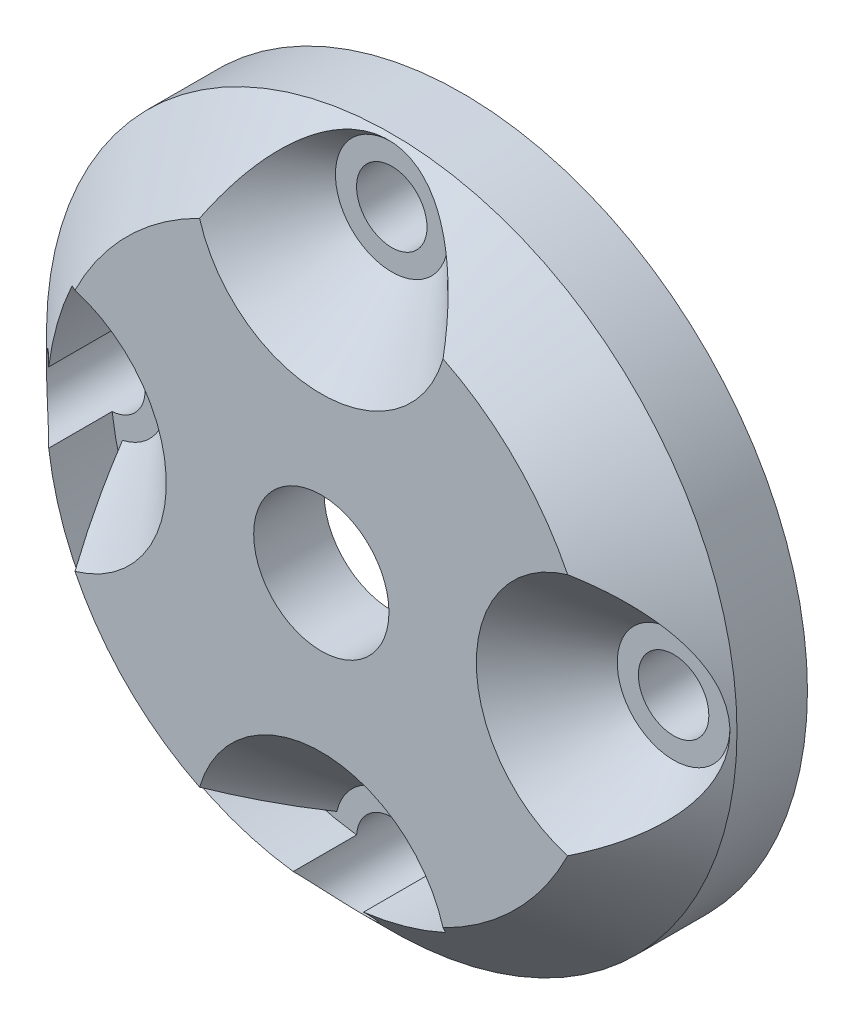
ISO-10303-21;
HEADER;
FILE_DESCRIPTION(('STEP AP214'),'2;1');
FILE_NAME('part.step','',(''),(''),'','','');
FILE_SCHEMA(('AUTOMOTIVE_DESIGN { 1 0 10303 214 1 1 1 1 }'));
ENDSEC;
DATA;
#1=APPLICATION_CONTEXT('core data for automotive mechanical design processes');
#2=APPLICATION_PROTOCOL_DEFINITION('international standard','automotive_design',2000,#1);
#3=PRODUCT_CONTEXT('',#1,'mechanical');
#4=PRODUCT('Part','Part','',(#3));
#5=PRODUCT_RELATED_PRODUCT_CATEGORY('part','',(#4));
#6=PRODUCT_DEFINITION_FORMATION('','',#4);
#7=PRODUCT_DEFINITION_CONTEXT('part definition',#1,'design');
#8=PRODUCT_DEFINITION('design','',#6,#7);
#9=PRODUCT_DEFINITION_SHAPE('','',#8);
#10=(LENGTH_UNIT() NAMED_UNIT(*) SI_UNIT(.MILLI.,.METRE.));
#11=(NAMED_UNIT(*) PLANE_ANGLE_UNIT() SI_UNIT($,.RADIAN.));
#12=(NAMED_UNIT(*) SI_UNIT($,.STERADIAN.) SOLID_ANGLE_UNIT());
#13=UNCERTAINTY_MEASURE_WITH_UNIT(LENGTH_MEASURE(1.E-05),#10,'distance_accuracy_value','');
#14=(GEOMETRIC_REPRESENTATION_CONTEXT(3) GLOBAL_UNCERTAINTY_ASSIGNED_CONTEXT((#13)) GLOBAL_UNIT_ASSIGNED_CONTEXT((#10,
#11,#12)) REPRESENTATION_CONTEXT('',''));
#15=CARTESIAN_POINT('',(0.,0.,0.));
#16=DIRECTION('',(0.,0.,1.));
#17=DIRECTION('',(1.,0.,0.));
#18=AXIS2_PLACEMENT_3D('',#15,#16,#17);
#19=CARTESIAN_POINT('',(10.,0.,0.));
#20=DIRECTION('',(0.,0.,1.));
#21=DIRECTION('',(1.,0.,0.));
#22=AXIS2_PLACEMENT_3D('',#19,#20,#21);
#23=CYLINDRICAL_SURFACE('',#22,1.25);
#24=CARTESIAN_POINT('',(10.,0.,0.));
#25=DIRECTION('',(0.,0.,1.));
#26=DIRECTION('',(1.,0.,0.));
#27=AXIS2_PLACEMENT_3D('',#24,#25,#26);
#28=CIRCLE('',#27,1.25);
#29=CARTESIAN_POINT('',(11.25,0.,0.));
#30=VERTEX_POINT('',#29);
#31=EDGE_CURVE('E204',#30,#30,#28,.T.);
#32=ORIENTED_EDGE('',*,*,#31,.F.);
#33=EDGE_LOOP('',(#32));
#34=FACE_BOUND('',#33,.T.);
#35=CARTESIAN_POINT('',(10.,0.,2.5));
#36=DIRECTION('',(0.,0.,1.));
#37=DIRECTION('',(1.,0.,0.));
#38=AXIS2_PLACEMENT_3D('',#35,#36,#37);
#39=CIRCLE('',#38,1.25);
#40=CARTESIAN_POINT('',(11.25,0.,2.5));
#41=VERTEX_POINT('',#40);
#42=EDGE_CURVE('E190',#41,#41,#39,.F.);
#43=ORIENTED_EDGE('',*,*,#42,.F.);
#44=EDGE_LOOP('',(#43));
#45=FACE_BOUND('',#44,.T.);
#46=ADVANCED_FACE('F55',(#34,#45),#23,.F.);
#47=CARTESIAN_POINT('',(0.,10.,0.));
#48=DIRECTION('',(0.,0.,1.));
#49=DIRECTION('',(1.,0.,0.));
#50=AXIS2_PLACEMENT_3D('',#47,#48,#49);
#51=CYLINDRICAL_SURFACE('',#50,1.25);
#52=CARTESIAN_POINT('',(0.,10.,0.));
#53=DIRECTION('',(0.,0.,1.));
#54=DIRECTION('',(1.,0.,0.));
#55=AXIS2_PLACEMENT_3D('',#52,#53,#54);
#56=CIRCLE('',#55,1.25);
#57=CARTESIAN_POINT('',(1.25,10.,0.));
#58=VERTEX_POINT('',#57);
#59=EDGE_CURVE('E200',#58,#58,#56,.T.);
#60=ORIENTED_EDGE('',*,*,#59,.F.);
#61=EDGE_LOOP('',(#60));
#62=FACE_BOUND('',#61,.T.);
#63=CARTESIAN_POINT('',(0.,10.,2.5));
#64=DIRECTION('',(0.,0.,1.));
#65=DIRECTION('',(1.,0.,0.));
#66=AXIS2_PLACEMENT_3D('',#63,#64,#65);
#67=CIRCLE('',#66,1.25);
#68=CARTESIAN_POINT('',(1.25,10.,2.5));
#69=VERTEX_POINT('',#68);
#70=EDGE_CURVE('E576',#69,#69,#67,.F.);
#71=ORIENTED_EDGE('',*,*,#70,.F.);
#72=EDGE_LOOP('',(#71));
#73=FACE_BOUND('',#72,.T.);
#74=ADVANCED_FACE('F277',(#62,#73),#51,.F.);
#75=CARTESIAN_POINT('',(0.,0.,5.));
#76=DIRECTION('',(0.,0.,-1.));
#77=DIRECTION('',(-1.,0.,0.));
#78=AXIS2_PLACEMENT_3D('',#75,#76,#77);
#79=CYLINDRICAL_SURFACE('',#78,2.4);
#80=CARTESIAN_POINT('',(0.,0.,5.));
#81=DIRECTION('',(0.,0.,1.));
#82=DIRECTION('',(1.,0.,0.));
#83=AXIS2_PLACEMENT_3D('',#80,#81,#82);
#84=CIRCLE('',#83,2.4);
#85=CARTESIAN_POINT('',(2.4,0.,5.));
#86=VERTEX_POINT('',#85);
#87=EDGE_CURVE('E219',#86,#86,#84,.T.);
#88=ORIENTED_EDGE('',*,*,#87,.T.);
#89=EDGE_LOOP('',(#88));
#90=FACE_BOUND('',#89,.T.);
#91=CARTESIAN_POINT('',(0.,0.,2.5));
#92=DIRECTION('',(0.,0.,-1.));
#93=DIRECTION('',(-1.,0.,0.));
#94=AXIS2_PLACEMENT_3D('',#91,#92,#93);
#95=CIRCLE('',#94,2.4);
#96=CARTESIAN_POINT('',(-2.4,0.,2.5));
#97=VERTEX_POINT('',#96);
#98=EDGE_CURVE('E216',#97,#97,#95,.T.);
#99=ORIENTED_EDGE('',*,*,#98,.T.);
#100=EDGE_LOOP('',(#99));
#101=FACE_BOUND('',#100,.T.);
#102=ADVANCED_FACE('F273',(#90,#101),#79,.F.);
#103=CARTESIAN_POINT('',(0.,0.,5.));
#104=DIRECTION('',(0.,0.,1.));
#105=DIRECTION('',(1.,0.,0.));
#106=AXIS2_PLACEMENT_3D('',#103,#104,#105);
#107=PLANE('',#106);
#108=CARTESIAN_POINT('',(0.,0.,5.));
#109=DIRECTION('',(0.,0.,1.));
#110=DIRECTION('',(1.,0.,0.));
#111=AXIS2_PLACEMENT_3D('',#108,#109,#110);
#112=CIRCLE('',#111,9.75);
#113=CARTESIAN_POINT('',(-4.32018224261304,8.7406249999992,5.));
#114=VERTEX_POINT('',#113);
#115=CARTESIAN_POINT('',(-8.74062499999988,4.32018224261167,5.));
#116=VERTEX_POINT('',#115);
#117=EDGE_CURVE('E232',#114,#116,#112,.T.);
#118=ORIENTED_EDGE('',*,*,#117,.T.);
#119=CARTESIAN_POINT('',(-9.99999999999972,-2.83604770904466E-13,5.));
#120=DIRECTION('',(0.,0.,1.));
#121=DIRECTION('',(1.,0.,0.));
#122=AXIS2_PLACEMENT_3D('',#119,#120,#121);
#123=CIRCLE('',#122,4.50000000000047);
#124=CARTESIAN_POINT('',(-8.74062499999963,-4.32018224261216,5.));
#125=VERTEX_POINT('',#124);
#126=EDGE_CURVE('E161',#116,#125,#123,.F.);
#127=ORIENTED_EDGE('',*,*,#126,.T.);
#128=CARTESIAN_POINT('',(0.,0.,5.));
#129=DIRECTION('',(0.,0.,1.));
#130=DIRECTION('',(1.,0.,0.));
#131=AXIS2_PLACEMENT_3D('',#128,#129,#130);
#132=CIRCLE('',#131,9.75);
#133=CARTESIAN_POINT('',(-4.32018224261149,-8.74062499999997,5.));
#134=VERTEX_POINT('',#133);
#135=EDGE_CURVE('E170',#125,#134,#132,.T.);
#136=ORIENTED_EDGE('',*,*,#135,.T.);
#137=CARTESIAN_POINT('',(5.64760248210638E-13,-10.,5.));
#138=DIRECTION('',(0.,0.,1.));
#139=DIRECTION('',(1.,0.,0.));
#140=AXIS2_PLACEMENT_3D('',#137,#138,#139);
#141=CIRCLE('',#140,4.50000000000063);
#142=CARTESIAN_POINT('',(4.32018224261248,-8.74062499999948,5.));
#143=VERTEX_POINT('',#142);
#144=EDGE_CURVE('E156',#134,#143,#141,.F.);
#145=ORIENTED_EDGE('',*,*,#144,.T.);
#146=CARTESIAN_POINT('',(8.74062500000006,-4.32018224261131,5.));
#147=VERTEX_POINT('',#146);
#148=EDGE_CURVE('E225',#143,#147,#112,.T.);
#149=ORIENTED_EDGE('',*,*,#148,.T.);
#150=CARTESIAN_POINT('',(10.0000000000003,2.82380124105319E-13,5.));
#151=DIRECTION('',(0.,0.,1.));
#152=DIRECTION('',(1.,0.,0.));
#153=AXIS2_PLACEMENT_3D('',#150,#151,#152);
#154=CIRCLE('',#153,4.50000000000023);
#155=CARTESIAN_POINT('',(8.74062499999981,4.3201822426118,5.));
#156=VERTEX_POINT('',#155);
#157=EDGE_CURVE('E354',#147,#156,#154,.F.);
#158=ORIENTED_EDGE('',*,*,#157,.T.);
#159=CARTESIAN_POINT('',(4.32018224261304,8.7406249999992,5.));
#160=VERTEX_POINT('',#159);
#161=EDGE_CURVE('E228',#156,#160,#112,.T.);
#162=ORIENTED_EDGE('',*,*,#161,.T.);
#163=CARTESIAN_POINT('',(0.,10.,5.));
#164=DIRECTION('',(0.,0.,1.));
#165=DIRECTION('',(1.,0.,0.));
#166=AXIS2_PLACEMENT_3D('',#163,#164,#165);
#167=CIRCLE('',#166,4.50000000000178);
#168=EDGE_CURVE('E345',#160,#114,#167,.F.);
#169=ORIENTED_EDGE('',*,*,#168,.T.);
#170=EDGE_LOOP('',(#118,#127,#136,#145,#149,#158,#162,#169));
#171=FACE_BOUND('',#170,.T.);
#172=ORIENTED_EDGE('',*,*,#87,.F.);
#173=EDGE_LOOP('',(#172));
#174=FACE_BOUND('',#173,.T.);
#175=ADVANCED_FACE('F276',(#171,#174),#107,.T.);
#176=CARTESIAN_POINT('',(0.,0.,0.));
#177=DIRECTION('',(0.,0.,1.));
#178=DIRECTION('',(1.,0.,0.));
#179=AXIS2_PLACEMENT_3D('',#176,#177,#178);
#180=PLANE('',#179);
#181=ORIENTED_EDGE('',*,*,#59,.T.);
#182=EDGE_LOOP('',(#181));
#183=FACE_BOUND('',#182,.T.);
#184=ORIENTED_EDGE('',*,*,#31,.T.);
#185=EDGE_LOOP('',(#184));
#186=FACE_BOUND('',#185,.T.);
#187=CARTESIAN_POINT('',(0.,-10.,0.));
#188=DIRECTION('',(0.,0.,1.));
#189=DIRECTION('',(1.,0.,0.));
#190=AXIS2_PLACEMENT_3D('',#187,#188,#189);
#191=CIRCLE('',#190,1.25);
#192=CARTESIAN_POINT('',(1.24999999999993,-10.,0.));
#193=VERTEX_POINT('',#192);
#194=EDGE_CURVE('E207',#193,#193,#191,.T.);
#195=ORIENTED_EDGE('',*,*,#194,.T.);
#196=EDGE_LOOP('',(#195));
#197=FACE_BOUND('',#196,.T.);
#198=CARTESIAN_POINT('',(-10.,1.04744440165294E-13,0.));
#199=DIRECTION('',(0.,0.,1.));
#200=DIRECTION('',(1.,0.,0.));
#201=AXIS2_PLACEMENT_3D('',#198,#199,#200);
#202=CIRCLE('',#201,1.25);
#203=CARTESIAN_POINT('',(-8.75,1.04744440165294E-13,0.));
#204=VERTEX_POINT('',#203);
#205=EDGE_CURVE('E210',#204,#204,#202,.T.);
#206=ORIENTED_EDGE('',*,*,#205,.T.);
#207=EDGE_LOOP('',(#206));
#208=FACE_BOUND('',#207,.T.);
#209=CARTESIAN_POINT('',(0.,0.,0.));
#210=DIRECTION('',(0.,0.,-1.));
#211=DIRECTION('',(-1.,0.,0.));
#212=AXIS2_PLACEMENT_3D('',#209,#210,#211);
#213=CIRCLE('',#212,7.5);
#214=CARTESIAN_POINT('',(-7.5,0.,0.));
#215=VERTEX_POINT('',#214);
#216=EDGE_CURVE('E203',#215,#215,#213,.T.);
#217=ORIENTED_EDGE('',*,*,#216,.F.);
#218=EDGE_LOOP('',(#217));
#219=FACE_BOUND('',#218,.T.);
#220=CARTESIAN_POINT('',(0.,0.,0.));
#221=DIRECTION('',(0.,0.,1.));
#222=DIRECTION('',(1.,0.,0.));
#223=AXIS2_PLACEMENT_3D('',#220,#221,#222);
#224=CIRCLE('',#223,12.25);
#225=CARTESIAN_POINT('',(12.25,0.,0.));
#226=VERTEX_POINT('',#225);
#227=EDGE_CURVE('E222',#226,#226,#224,.T.);
#228=ORIENTED_EDGE('',*,*,#227,.F.);
#229=EDGE_LOOP('',(#228));
#230=FACE_BOUND('',#229,.T.);
#231=ADVANCED_FACE('F281',(#183,#186,#197,#208,#219,#230),#180,.F.);
#232=CARTESIAN_POINT('',(0.,0.,5.));
#233=DIRECTION('',(0.,0.,-1.));
#234=DIRECTION('',(-1.,0.,0.));
#235=AXIS2_PLACEMENT_3D('',#232,#233,#234);
#236=CYLINDRICAL_SURFACE('',#235,12.25);
#237=CARTESIAN_POINT('',(0.,0.,2.49999999999999));
#238=DIRECTION('',(0.,0.,1.));
#239=DIRECTION('',(1.,0.,0.));
#240=AXIS2_PLACEMENT_3D('',#237,#238,#239);
#241=CIRCLE('',#240,12.25);
#242=CARTESIAN_POINT('',(12.25,0.,2.49999999999999));
#243=VERTEX_POINT('',#242);
#244=EDGE_CURVE('E231',#243,#243,#241,.F.);
#245=ORIENTED_EDGE('',*,*,#244,.T.);
#246=EDGE_LOOP('',(#245));
#247=FACE_BOUND('',#246,.T.);
#248=ORIENTED_EDGE('',*,*,#227,.T.);
#249=EDGE_LOOP('',(#248));
#250=FACE_BOUND('',#249,.T.);
#251=ADVANCED_FACE('F271',(#247,#250),#236,.T.);
#252=CARTESIAN_POINT('',(0.,0.,2.5));
#253=DIRECTION('',(0.,0.,-1.));
#254=DIRECTION('',(-1.,0.,0.));
#255=AXIS2_PLACEMENT_3D('',#252,#253,#254);
#256=CYLINDRICAL_SURFACE('',#255,7.5);
#257=CARTESIAN_POINT('',(0.,0.,2.5));
#258=DIRECTION('',(0.,0.,-1.));
#259=DIRECTION('',(-1.,0.,0.));
#260=AXIS2_PLACEMENT_3D('',#257,#258,#259);
#261=CIRCLE('',#260,7.5);
#262=CARTESIAN_POINT('',(-7.5,0.,2.5));
#263=VERTEX_POINT('',#262);
#264=EDGE_CURVE('E213',#263,#263,#261,.T.);
#265=ORIENTED_EDGE('',*,*,#264,.F.);
#266=EDGE_LOOP('',(#265));
#267=FACE_BOUND('',#266,.T.);
#268=ORIENTED_EDGE('',*,*,#216,.T.);
#269=EDGE_LOOP('',(#268));
#270=FACE_BOUND('',#269,.T.);
#271=ADVANCED_FACE('F267',(#267,#270),#256,.F.);
#272=CARTESIAN_POINT('',(0.,0.,2.5));
#273=DIRECTION('',(0.,0.,-1.));
#274=DIRECTION('',(-1.,0.,0.));
#275=AXIS2_PLACEMENT_3D('',#272,#273,#274);
#276=PLANE('',#275);
#277=ORIENTED_EDGE('',*,*,#98,.F.);
#278=EDGE_LOOP('',(#277));
#279=FACE_BOUND('',#278,.T.);
#280=ORIENTED_EDGE('',*,*,#264,.T.);
#281=EDGE_LOOP('',(#280));
#282=FACE_BOUND('',#281,.T.);
#283=ADVANCED_FACE('F264',(#279,#282),#276,.T.);
#284=CARTESIAN_POINT('',(0.,0.,5.));
#285=DIRECTION('',(0.,0.,-1.));
#286=DIRECTION('',(-1.,0.,0.));
#287=AXIS2_PLACEMENT_3D('',#284,#285,#286);
#288=CONICAL_SURFACE('',#287,9.75,0.785398163397447);
#289=CARTESIAN_POINT('',(0.,0.,4.75));
#290=DIRECTION('',(0.,0.,-1.));
#291=DIRECTION('',(-1.,0.,0.));
#292=AXIS2_PLACEMENT_3D('',#289,#290,#291);
#293=CIRCLE('',#292,10.);
#294=CARTESIAN_POINT('',(-9.09687499999981,4.15293453287895,4.75));
#295=VERTEX_POINT('',#294);
#296=CARTESIAN_POINT('',(-9.92187499999999,1.2475562048963,4.75));
#297=VERTEX_POINT('',#296);
#298=EDGE_CURVE('E193',#295,#297,#293,.F.);
#299=ORIENTED_EDGE('',*,*,#298,.F.);
#300=CARTESIAN_POINT('',(-9.09687499999981,4.15293453287895,4.75));
#301=CARTESIAN_POINT('',(-9.03799781672567,4.18239221546086,4.79131732159591));
#302=CARTESIAN_POINT('',(-8.97887165867161,4.21105839506153,4.83280936233562));
#303=CARTESIAN_POINT('',(-8.86012165646222,4.26680762461525,4.91614269721942));
#304=CARTESIAN_POINT('',(-8.80049781451638,4.29389068159238,4.95798398981301));
#305=CARTESIAN_POINT('',(-8.74062500000011,4.32018224261234,4.99999999999986));
#306=B_SPLINE_CURVE_WITH_KNOTS('',3,(#300,#301,#302,#303,#304,#305),.UNSPECIFIED.,.F.,.F.,(4,2,
4),(0.,0.233137677724734,0.466274320974145),.UNSPECIFIED.);
#307=EDGE_CURVE('E338',#295,#116,#306,.T.);
#308=ORIENTED_EDGE('',*,*,#307,.T.);
#309=ORIENTED_EDGE('',*,*,#117,.F.);
#310=CARTESIAN_POINT('',(-4.32018224261304,8.7406249999992,5.));
#311=CARTESIAN_POINT('',(-4.24543055087863,8.91058201609543,4.88073191852881));
#312=CARTESIAN_POINT('',(-4.16452033532962,9.07882987951336,4.76266324244619));
#313=CARTESIAN_POINT('',(-3.98900218578794,9.41105191644683,4.5295249709142));
#314=CARTESIAN_POINT('',(-3.8943538287284,9.57501173142422,4.41446545163195));
#315=CARTESIAN_POINT('',(-3.68898800019662,9.8990149787888,4.18709475172665));
#316=CARTESIAN_POINT('',(-3.57806427853655,10.0589715511141,4.07484452553301));
#317=CARTESIAN_POINT('',(-3.33983066901543,10.3703159019421,3.85635726179548));
#318=CARTESIAN_POINT('',(-3.21254260452706,10.52171471272,3.75011248230405));
#319=CARTESIAN_POINT('',(-3.0021155514262,10.7467492054825,3.59219354001071));
#320=CARTESIAN_POINT('',(-2.92530867099643,10.8243666997947,3.53772512294688));
#321=CARTESIAN_POINT('',(-2.76610897034105,10.9756572422736,3.43155632122561));
#322=CARTESIAN_POINT('',(-2.68371593121603,11.0493301356643,3.37985604518288));
#323=CARTESIAN_POINT('',(-2.42832866149789,11.2629506525067,3.22994691045144));
#324=CARTESIAN_POINT('',(-2.24656738245421,11.396111832867,3.1365004678006));
#325=CARTESIAN_POINT('',(-1.88803443535945,11.6185989153388,2.98036918252651));
#326=CARTESIAN_POINT('',(-1.71463674973222,11.7115064915249,2.91517088422964));
#327=CARTESIAN_POINT('',(-1.4425049660832,11.8325463946807,2.83023060082394));
#328=CARTESIAN_POINT('',(-1.34979089782447,11.8698387677386,2.80406051402755));
#329=CARTESIAN_POINT('',(-1.16068321970715,11.937580161585,2.75652269346862));
#330=CARTESIAN_POINT('',(-1.06429035777016,11.9680305648091,2.73515398957565));
#331=CARTESIAN_POINT('',(-0.88516255211972,12.0167920225301,2.70093542281237));
#332=CARTESIAN_POINT('',(-0.802907353842056,12.0362882027188,2.68725389281854));
#333=CARTESIAN_POINT('',(-0.636727261646473,12.0697030799028,2.66380485622176));
#334=CARTESIAN_POINT('',(-0.552802677513388,12.0836228017609,2.65403663041677));
#335=CARTESIAN_POINT('',(-0.383849904894684,12.1055961116841,2.63861676380702));
#336=CARTESIAN_POINT('',(-0.298822235814207,12.1136523654161,2.63296325235893));
#337=CARTESIAN_POINT('',(-0.128230244820367,12.1237340377041,2.62588839457439));
#338=CARTESIAN_POINT('',(-0.0426659115687846,12.1257593284097,2.62446713795756));
#339=CARTESIAN_POINT('',(0.128416440977701,12.1237323186584,2.62588960094193));
#340=CARTESIAN_POINT('',(0.213934382495788,12.1196756386246,2.62873639393044));
#341=CARTESIAN_POINT('',(0.384223345047145,12.1055676446171,2.63863674063701));
#342=CARTESIAN_POINT('',(0.468994380781321,12.0955164488987,2.64569021136897));
#343=CARTESIAN_POINT('',(0.637244232720792,12.0696286751011,2.66385707017603));
#344=CARTESIAN_POINT('',(0.720722415955601,12.0537893510658,2.67497238523778));
#345=CARTESIAN_POINT('',(0.885847495421421,12.0166428594523,2.70104009861224));
#346=CARTESIAN_POINT('',(0.967494019606444,11.995334591765,2.71599326893126));
#347=CARTESIAN_POINT('',(1.14747858961473,11.942022858339,2.75340501169882));
#348=CARTESIAN_POINT('',(1.2452283254722,11.9086827110757,2.77680160626641));
#349=CARTESIAN_POINT('',(1.43671740415513,11.8350638340698,2.82846397609192));
#350=CARTESIAN_POINT('',(1.53045587567995,11.7947836063028,2.85673080259491));
#351=CARTESIAN_POINT('',(1.80527029556331,11.6646869613749,2.94802669377099));
#352=CARTESIAN_POINT('',(1.97991334138394,11.5656244691158,3.01754423219616));
#353=CARTESIAN_POINT('',(2.26556579338593,11.3786671030996,3.148742383792));
#354=CARTESIAN_POINT('',(2.38094500104693,11.2950878142413,3.20739451632934));
#355=CARTESIAN_POINT('',(2.60239134241148,11.1199493930959,3.33029867151777));
#356=CARTESIAN_POINT('',(2.70845396515104,11.0283864375138,3.39455337718298));
#357=CARTESIAN_POINT('',(2.91211598605587,10.838357346249,3.52790712543934));
#358=CARTESIAN_POINT('',(3.00966815821245,10.7398575728071,3.59702977347568));
#359=CARTESIAN_POINT('',(3.19624107840475,10.5375669230492,3.73898812418424));
#360=CARTESIAN_POINT('',(3.28525888770332,10.4337742428769,3.81182509272055));
#361=CARTESIAN_POINT('',(3.51085592536722,10.1526104820936,4.0091329950171));
#362=CARTESIAN_POINT('',(3.64048937532483,9.97149179837783,4.13623382569789));
#363=CARTESIAN_POINT('',(3.88009902611081,9.60058515237342,4.39651919131812));
#364=CARTESIAN_POINT('',(3.99005002091879,9.41078645899057,4.52971125685));
#365=CARTESIAN_POINT('',(4.1898427721753,9.02896961976514,4.79765289840831));
#366=CARTESIAN_POINT('',(4.28005893327608,8.83708217811747,4.93231075219275));
#367=CARTESIAN_POINT('',(4.403344118301,8.54620496243802,5.13643511408045));
#368=CARTESIAN_POINT('',(4.44238673420518,8.44887557245834,5.20473644038651));
#369=CARTESIAN_POINT('',(4.51665709369797,8.25326022888509,5.34201036570432));
#370=CARTESIAN_POINT('',(4.55188536149929,8.15497440876408,5.41098287105114));
#371=CARTESIAN_POINT('',(4.58528091025884,8.05626806158997,5.48025048309402));
#372=B_SPLINE_CURVE_WITH_KNOTS('',3,(#310,#311,#312,#313,#314,#315,#316,#317,#318,#319,#320,
#321,#322,#323,#324,#325,#326,#327,#328,#329,#330,#331,#332,#333,#334,#335,#336,#337,#338,#339,
#340,#341,#342,#343,#344,#345,#346,#347,#348,#349,#350,#351,#352,#353,#354,#355,#356,#357,#358,
#359,#360,#361,#362,#363,#364,#365,#366,#367,#368,#369,#370,#371),.UNSPECIFIED.,.F.,.F.,(4,2,2,
2,2,2,2,2,2,2,2,2,2,2,2,2,2,2,2,2,2,2,2,2,2,2,2,2,2,2,4),(0.,0.662116786278049,1.32622283478107,
1.99961813669494,2.67212454228379,3.0380024716121,3.4038947465422,4.13289926769088,
4.75207166703768,5.06164280315133,5.37115133334658,5.62778803994823,5.88437755921193,
6.14085035401772,6.39732858575519,6.65399159407867,6.91064953931984,7.16742940451593,
7.42426096297382,7.74147029705656,8.0587481871096,8.69340503262906,9.1550771101033,
9.61697150475957,10.0812846092795,10.5457570262092,11.3138365640691,12.0828928014549,
12.8357691109311,13.2111653752669,13.586509982561),.UNSPECIFIED.);
#373=EDGE_CURVE('E383',#114,#160,#372,.T.);
#374=ORIENTED_EDGE('',*,*,#373,.T.);
#375=ORIENTED_EDGE('',*,*,#161,.F.);
#376=CARTESIAN_POINT('',(8.74062499999981,4.3201822426118,5.));
#377=CARTESIAN_POINT('',(8.910582016096,4.24543055087746,4.8807319185288));
#378=CARTESIAN_POINT('',(9.07882987951389,4.16452033532851,4.76266324244616));
#379=CARTESIAN_POINT('',(9.4110519164473,3.98900218578696,4.52952497091414));
#380=CARTESIAN_POINT('',(9.57501173142466,3.89435382872749,4.41446545163188));
#381=CARTESIAN_POINT('',(9.89901497878919,3.68898800019584,4.18709475172656));
#382=CARTESIAN_POINT('',(10.0589715511144,3.57806427853583,4.07484452553291));
#383=CARTESIAN_POINT('',(10.3703159019424,3.33983066901483,3.85635726179536));
#384=CARTESIAN_POINT('',(10.5217147127203,3.21254260452653,3.75011248230392));
#385=CARTESIAN_POINT('',(10.7467492054828,3.00211555142577,3.59219354001057));
#386=CARTESIAN_POINT('',(10.824366699795,2.92530867099604,3.53772512294674));
#387=CARTESIAN_POINT('',(10.9756572422738,2.76610897034075,3.43155632122547));
#388=CARTESIAN_POINT('',(11.0493301356645,2.68371593121576,3.37985604518275));
#389=CARTESIAN_POINT('',(11.2629506525069,2.42832866149776,3.22994691045131));
#390=CARTESIAN_POINT('',(11.3961118328671,2.24656738245416,3.13650046780047));
#391=CARTESIAN_POINT('',(11.6185989153389,1.88803443535955,2.98036918252638));
#392=CARTESIAN_POINT('',(11.711506491525,1.71463674973239,2.91517088422952));
#393=CARTESIAN_POINT('',(11.8325463946808,1.44250496608348,2.83023060082381));
#394=CARTESIAN_POINT('',(11.8698387677387,1.34979089782478,2.80406051402742));
#395=CARTESIAN_POINT('',(11.9375801615851,1.16068321970753,2.75652269346848));
#396=CARTESIAN_POINT('',(11.9680305648093,1.06429035777058,2.73515398957551));
#397=CARTESIAN_POINT('',(12.0167920225302,0.885162552120198,2.70093542281222));
#398=CARTESIAN_POINT('',(12.036288202719,0.802907353842563,2.68725389281839));
#399=CARTESIAN_POINT('',(12.069703079903,0.636727261647036,2.6638048562216));
#400=CARTESIAN_POINT('',(12.0836228017611,0.552802677513978,2.65403663041661));
#401=CARTESIAN_POINT('',(12.1055961116843,0.38384990489533,2.63861676380684));
#402=CARTESIAN_POINT('',(12.1136523654162,0.29882223581488,2.63296325235875));
#403=CARTESIAN_POINT('',(12.1237340377043,0.128230244821094,2.62588839457419));
#404=CARTESIAN_POINT('',(12.1257593284099,0.0426659115695368,2.62446713795736));
#405=CARTESIAN_POINT('',(12.1237323186587,-0.128416440976899,2.62588960094172));
#406=CARTESIAN_POINT('',(12.1196756386248,-0.213934382494961,2.62873639393022));
#407=CARTESIAN_POINT('',(12.1055676446174,-0.38422334504627,2.63863674063677));
#408=CARTESIAN_POINT('',(12.095516448899,-0.468994380780424,2.64569021136872));
#409=CARTESIAN_POINT('',(12.0696286751014,-0.63724423271985,2.66385707017577));
#410=CARTESIAN_POINT('',(12.0537893510662,-0.720722415954637,2.67497238523751));
#411=CARTESIAN_POINT('',(12.0166428594526,-0.885847495420414,2.70104009861195));
#412=CARTESIAN_POINT('',(11.9953345917653,-0.967494019605417,2.71599326893096));
#413=CARTESIAN_POINT('',(11.9420228583394,-1.14747858961363,2.75340501169849));
#414=CARTESIAN_POINT('',(11.9086827110762,-1.24522832547106,2.77680160626607));
#415=CARTESIAN_POINT('',(11.8350638340703,-1.4367174041539,2.82846397609154));
#416=CARTESIAN_POINT('',(11.7947836063034,-1.53045587567868,2.85673080259452));
#417=CARTESIAN_POINT('',(11.6646869613756,-1.80527029556191,2.94802669377054));
#418=CARTESIAN_POINT('',(11.5656244691166,-1.97991334138247,3.01754423219567));
#419=CARTESIAN_POINT('',(11.3786671031005,-2.26556579338431,3.14874238379143));
#420=CARTESIAN_POINT('',(11.2950878142423,-2.38094500104523,3.20739451632873));
#421=CARTESIAN_POINT('',(11.1199493930971,-2.60239134240965,3.33029867151706));
#422=CARTESIAN_POINT('',(11.028386437515,-2.70845396514914,3.39455337718223));
#423=CARTESIAN_POINT('',(10.8383573462504,-2.91211598605386,3.5279071254385));
#424=CARTESIAN_POINT('',(10.7398575728086,-3.00966815821038,3.59702977347479));
#425=CARTESIAN_POINT('',(10.5375669230509,-3.19624107840257,3.73898812418326));
#426=CARTESIAN_POINT('',(10.4337742428787,-3.28525888770108,3.81182509271952));
#427=CARTESIAN_POINT('',(10.1526104820957,-3.51085592536485,4.00913299501593));
#428=CARTESIAN_POINT('',(9.97149179838005,-3.64048937532238,4.13623382569663));
#429=CARTESIAN_POINT('',(9.60058515237601,-3.8800990261082,4.39651919131669));
#430=CARTESIAN_POINT('',(9.41078645899335,-3.99005002091611,4.52971125684849));
#431=CARTESIAN_POINT('',(9.02896961976829,-4.18984277217251,4.79765289840662));
#432=CARTESIAN_POINT('',(8.83708217812081,-4.28005893327324,4.93231075219098));
#433=CARTESIAN_POINT('',(8.54620496244165,-4.40334411829809,5.13643511407856));
#434=CARTESIAN_POINT('',(8.44887557246207,-4.44238673420226,5.20473644038457));
#435=CARTESIAN_POINT('',(8.25326022888901,-4.51665709369502,5.34201036570231));
#436=CARTESIAN_POINT('',(8.15497440876809,-4.55188536149631,5.41098287104908));
#437=CARTESIAN_POINT('',(8.05626806159408,-4.58528091025585,5.48025048309192));
#438=B_SPLINE_CURVE_WITH_KNOTS('',3,(#376,#377,#378,#379,#380,#381,#382,#383,#384,#385,#386,
#387,#388,#389,#390,#391,#392,#393,#394,#395,#396,#397,#398,#399,#400,#401,#402,#403,#404,#405,
#406,#407,#408,#409,#410,#411,#412,#413,#414,#415,#416,#417,#418,#419,#420,#421,#422,#423,#424,
#425,#426,#427,#428,#429,#430,#431,#432,#433,#434,#435,#436,#437),.UNSPECIFIED.,.F.,.F.,(4,2,2,
2,2,2,2,2,2,2,2,2,2,2,2,2,2,2,2,2,2,2,2,2,2,2,2,2,2,2,4),(0.,0.662116786277918,1.32622283478081,
1.99961813669455,2.67212454228327,3.03800247161146,3.40389474654145,4.13289926768991,
4.75207166703652,5.06164280315007,5.37115133334524,5.62778803994681,5.88437755921044,
6.14085035401615,6.39732858575354,6.65399159407695,6.91064953931804,7.16742940451406,
7.42426096297187,7.74147029705444,8.05874818710731,8.69340503262643,9.15507711010034,
9.61697150475626,10.0812846092758,10.5457570262052,11.3138365640644,12.0828928014496,
12.8357691109252,13.2111653752607,13.5865099825545),.UNSPECIFIED.);
#439=EDGE_CURVE('E390',#156,#147,#438,.T.);
#440=ORIENTED_EDGE('',*,*,#439,.T.);
#441=ORIENTED_EDGE('',*,*,#148,.F.);
#442=CARTESIAN_POINT('',(4.32018224261248,-8.74062499999948,5.));
#443=CARTESIAN_POINT('',(4.29389068159281,-8.80049781451583,4.95798398981309));
#444=CARTESIAN_POINT('',(4.26680762461592,-8.86012165646175,4.91614269721946));
#445=CARTESIAN_POINT('',(4.21105839506255,-8.97887165867127,4.8328093623356));
#446=CARTESIAN_POINT('',(4.182392215462,-9.03799781672537,4.79131732159589));
#447=CARTESIAN_POINT('',(4.15293453288015,-9.09687499999955,4.74999999999998));
#448=B_SPLINE_CURVE_WITH_KNOTS('',3,(#442,#443,#444,#445,#446,#447),.UNSPECIFIED.,.F.,.F.,(4,2,
4),(0.,0.233136643249415,0.466274320974145),.UNSPECIFIED.);
#449=CARTESIAN_POINT('',(4.15293453287981,-9.09687499999942,4.75));
#450=VERTEX_POINT('',#449);
#451=EDGE_CURVE('E346',#143,#450,#448,.T.);
#452=ORIENTED_EDGE('',*,*,#451,.T.);
#453=CARTESIAN_POINT('',(1.24755620489613,-9.92187500000001,4.75));
#454=VERTEX_POINT('',#453);
#455=EDGE_CURVE('E189',#454,#450,#293,.F.);
#456=ORIENTED_EDGE('',*,*,#455,.F.);
#457=CARTESIAN_POINT('',(-1.20695824835656,-9.674805002,5.0002));
#458=CARTESIAN_POINT('',(-1.21976445975079,-9.72239160453343,4.95138865162277));
#459=CARTESIAN_POINT('',(-1.22973242905702,-9.77053517448672,4.90237964318827));
#460=CARTESIAN_POINT('',(-1.24394497358429,-9.86763596422947,4.80426678805982));
#461=CARTESIAN_POINT('',(-1.24818539963852,-9.91659374789222,4.75516289839146));
#462=CARTESIAN_POINT('',(-1.25088759318669,-10.0153307496973,4.65685611534239));
#463=CARTESIAN_POINT('',(-1.24930470061879,-10.0651133891624,4.60765536122701));
#464=CARTESIAN_POINT('',(-1.24010793511661,-10.16472291998,4.50991464724257));
#465=CARTESIAN_POINT('',(-1.23249629102383,-10.2145497881824,4.46137444990898));
#466=CARTESIAN_POINT('',(-1.20477446098753,-10.3427542049144,4.33734716676866));
#467=CARTESIAN_POINT('',(-1.17997135049805,-10.4208947387481,4.26259458859225));
#468=CARTESIAN_POINT('',(-1.11356110184696,-10.5739464461881,4.11765997009041));
#469=CARTESIAN_POINT('',(-1.07200465338039,-10.6488666134649,4.0474648777022));
#470=CARTESIAN_POINT('',(-0.983904028439045,-10.7737245451056,3.93152355023704));
#471=CARTESIAN_POINT('',(-0.94148845434421,-10.8250812290403,3.88417606837194));
#472=CARTESIAN_POINT('',(-0.846191260101381,-10.922546096206,3.79484565335317));
#473=CARTESIAN_POINT('',(-0.793322548135468,-10.968660643233,3.75285620794701));
#474=CARTESIAN_POINT('',(-0.689366695818353,-11.0442633830384,3.68434652944466));
#475=CARTESIAN_POINT('',(-0.640263436552188,-11.0752058357713,3.6564323681809));
#476=CARTESIAN_POINT('',(-0.535890131137998,-11.130845566877,3.60639029062851));
#477=CARTESIAN_POINT('',(-0.480622620776136,-11.1555453997174,3.58426000746171));
#478=CARTESIAN_POINT('',(-0.364402001826746,-11.1973110797569,3.54691661539819));
#479=CARTESIAN_POINT('',(-0.303402194576797,-11.2143062118791,3.53176756133762));
#480=CARTESIAN_POINT('',(-0.178088308611032,-11.238889036581,3.50987519872352));
#481=CARTESIAN_POINT('',(-0.113777935926148,-11.2464870201568,3.50312269490419));
#482=CARTESIAN_POINT('',(0.00603815047661829,-11.2512077285414,3.49892648487253));
#483=CARTESIAN_POINT('',(0.0614532656591141,-11.2497022026558,3.50026379159198));
#484=CARTESIAN_POINT('',(0.171060312020838,-11.2394618009664,3.50937026775345));
#485=CARTESIAN_POINT('',(0.225252419996828,-11.2307279770447,3.51713850134902));
#486=CARTESIAN_POINT('',(0.328915280746822,-11.2070788014252,3.5382124371554));
#487=CARTESIAN_POINT('',(0.378486626807025,-11.1924050165766,3.55130181825563));
#488=CARTESIAN_POINT('',(0.474102876855403,-11.1577207548421,3.58231647042631));
#489=CARTESIAN_POINT('',(0.520146362113555,-11.137708145296,3.60024367405853));
#490=CARTESIAN_POINT('',(0.624099219140933,-11.0851326113697,3.64748272688518));
#491=CARTESIAN_POINT('',(0.68023773330972,-11.0506519843985,3.67856411177538));
#492=CARTESIAN_POINT('',(0.784199668891562,-10.9755323985525,3.74662274453049));
#493=CARTESIAN_POINT('',(0.832007965458523,-10.9348824835501,3.78361048780389));
#494=CARTESIAN_POINT('',(0.933565712881524,-10.8351875797645,3.87484746339798));
#495=CARTESIAN_POINT('',(0.984150202498731,-10.7744726426554,3.93078733633196));
#496=CARTESIAN_POINT('',(1.07144030798167,-10.6483933739961,4.04795246094436));
#497=CARTESIAN_POINT('',(1.1081234234724,-10.5830217066025,4.10918608590394));
#498=CARTESIAN_POINT('',(1.17798343320614,-10.4290231877601,4.25477434880852));
#499=CARTESIAN_POINT('',(1.20651608685793,-10.3394906098696,4.3403937571653));
#500=CARTESIAN_POINT('',(1.24319054219964,-10.159445693279,4.51481386950163));
#501=CARTESIAN_POINT('',(1.25132354730945,-10.0689329488089,4.60361592914449));
#502=CARTESIAN_POINT('',(1.24896663162902,-9.92761867394146,4.74412624447335));
#503=CARTESIAN_POINT('',(1.24493167720488,-9.8763182097527,4.79552910901942));
#504=CARTESIAN_POINT('',(1.23059834093948,-9.77475305974226,4.89808680107268));
#505=CARTESIAN_POINT('',(1.22032430556098,-9.72448512905789,4.94924181751646));
#506=CARTESIAN_POINT('',(1.20695824835643,-9.67480500200001,5.0002));
#507=B_SPLINE_CURVE_WITH_KNOTS('',3,(#457,#458,#459,#460,#461,#462,#463,#464,#465,#466,#467,
#468,#469,#470,#471,#472,#473,#474,#475,#476,#477,#478,#479,#480,#481,#482,#483,#484,#485,#486,
#487,#488,#489,#490,#491,#492,#493,#494,#495,#496,#497,#498,#499,#500,#501,#502,#503,#504,#505,
#506),.UNSPECIFIED.,.F.,.F.,(4,2,2,2,2,2,2,2,2,2,2,2,2,2,2,2,2,2,2,2,2,2,2,2,4),(0.,
0.208019411123197,0.416189435714611,0.625959269548173,0.835651587233303,1.16721337330832,
1.49777941039354,1.74211804494013,1.98615681852295,2.17863184547323,2.37102798404245,
2.5651558907553,2.75907101552142,2.92457302053977,3.09005094547677,3.24938453088045,
3.40878185962732,3.62612216839785,3.84385307193456,4.1327443584188,4.42210125915874,
4.80151165314553,5.18108562546977,5.3990407577028,5.6161507911615),.UNSPECIFIED.);
#508=CARTESIAN_POINT('',(-1.24755620489627,-9.92187499999999,4.75));
#509=VERTEX_POINT('',#508);
#510=EDGE_CURVE('E244',#509,#454,#507,.T.);
#511=ORIENTED_EDGE('',*,*,#510,.F.);
#512=CARTESIAN_POINT('',(-9.92187500000001,-1.24755620489609,4.75));
#513=VERTEX_POINT('',#512);
#514=EDGE_CURVE('E192',#513,#509,#293,.F.);
#515=ORIENTED_EDGE('',*,*,#514,.F.);
#516=CARTESIAN_POINT('',(-9.67480500199999,1.2069582483566,5.0002));
#517=CARTESIAN_POINT('',(-9.72239160453342,1.21976445975083,4.95138865162277));
#518=CARTESIAN_POINT('',(-9.77053517448672,1.22973242905705,4.90237964318827));
#519=CARTESIAN_POINT('',(-9.86763596422947,1.24394497358432,4.80426678805982));
#520=CARTESIAN_POINT('',(-9.91659374789222,1.24818539963856,4.75516289839146));
#521=CARTESIAN_POINT('',(-10.0153307496973,1.25088759318672,4.65685611534239));
#522=CARTESIAN_POINT('',(-10.0651133891624,1.24930470061882,4.60765536122701));
#523=CARTESIAN_POINT('',(-10.16472291998,1.24010793511664,4.50991464724257));
#524=CARTESIAN_POINT('',(-10.2145497881824,1.23249629102387,4.46137444990898));
#525=CARTESIAN_POINT('',(-10.3427542049144,1.20477446098757,4.33734716676866));
#526=CARTESIAN_POINT('',(-10.4208947387481,1.17997135049809,4.26259458859224));
#527=CARTESIAN_POINT('',(-10.5739464461881,1.113561101847,4.11765997009041));
#528=CARTESIAN_POINT('',(-10.6488666134649,1.07200465338043,4.0474648777022));
#529=CARTESIAN_POINT('',(-10.7737245451056,0.983904028439081,3.93152355023704));
#530=CARTESIAN_POINT('',(-10.8250812290403,0.941488454344246,3.88417606837194));
#531=CARTESIAN_POINT('',(-10.922546096206,0.846191260101417,3.79484565335316));
#532=CARTESIAN_POINT('',(-10.968660643233,0.793322548135504,3.75285620794701));
#533=CARTESIAN_POINT('',(-11.0442633830384,0.689366695818389,3.68434652944466));
#534=CARTESIAN_POINT('',(-11.0752058357713,0.640263436552224,3.6564323681809));
#535=CARTESIAN_POINT('',(-11.130845566877,0.535890131138034,3.60639029062851));
#536=CARTESIAN_POINT('',(-11.1555453997174,0.480622620776172,3.58426000746172));
#537=CARTESIAN_POINT('',(-11.1973110797569,0.364402001826782,3.54691661539819));
#538=CARTESIAN_POINT('',(-11.2143062118791,0.303402194576833,3.53176756133762));
#539=CARTESIAN_POINT('',(-11.238889036581,0.178088308611069,3.50987519872352));
#540=CARTESIAN_POINT('',(-11.2464870201568,0.113777935926185,3.50312269490419));
#541=CARTESIAN_POINT('',(-11.2512077285414,-0.00603815047658186,3.49892648487253));
#542=CARTESIAN_POINT('',(-11.2497022026558,-0.0614532656590778,3.50026379159198));
#543=CARTESIAN_POINT('',(-11.2394618009664,-0.171060312020801,3.50937026775345));
#544=CARTESIAN_POINT('',(-11.2307279770447,-0.225252419996792,3.51713850134902));
#545=CARTESIAN_POINT('',(-11.2070788014252,-0.328915280746785,3.5382124371554));
#546=CARTESIAN_POINT('',(-11.1924050165766,-0.378486626806989,3.55130181825563));
#547=CARTESIAN_POINT('',(-11.1577207548421,-0.474102876855367,3.58231647042631));
#548=CARTESIAN_POINT('',(-11.137708145296,-0.520146362113519,3.60024367405854));
#549=CARTESIAN_POINT('',(-11.0851326113697,-0.624099219140897,3.64748272688518));
#550=CARTESIAN_POINT('',(-11.0506519843985,-0.680237733309684,3.67856411177538));
#551=CARTESIAN_POINT('',(-10.9755323985525,-0.784199668891525,3.74662274453049));
#552=CARTESIAN_POINT('',(-10.9348824835501,-0.832007965458487,3.78361048780389));
#553=CARTESIAN_POINT('',(-10.8351875797645,-0.933565712881487,3.87484746339798));
#554=CARTESIAN_POINT('',(-10.7744726426554,-0.984150202498695,3.93078733633196));
#555=CARTESIAN_POINT('',(-10.6483933739961,-1.07144030798164,4.04795246094436));
#556=CARTESIAN_POINT('',(-10.5830217066025,-1.10812342347237,4.10918608590394));
#557=CARTESIAN_POINT('',(-10.4290231877601,-1.17798343320611,4.25477434880853));
#558=CARTESIAN_POINT('',(-10.3394906098696,-1.2065160868579,4.3403937571653));
#559=CARTESIAN_POINT('',(-10.159445693279,-1.2431905421996,4.51481386950163));
#560=CARTESIAN_POINT('',(-10.0689329488089,-1.25132354730941,4.6036159291445));
#561=CARTESIAN_POINT('',(-9.92761867394145,-1.24896663162899,4.74412624447335));
#562=CARTESIAN_POINT('',(-9.8763182097527,-1.24493167720485,4.79552910901943));
#563=CARTESIAN_POINT('',(-9.77475305974226,-1.23059834093945,4.89808680107268));
#564=CARTESIAN_POINT('',(-9.72448512905789,-1.22032430556094,4.94924181751645));
#565=CARTESIAN_POINT('',(-9.67480500200002,-1.2069582483564,5.0002));
#566=B_SPLINE_CURVE_WITH_KNOTS('',3,(#516,#517,#518,#519,#520,#521,#522,#523,#524,#525,#526,
#527,#528,#529,#530,#531,#532,#533,#534,#535,#536,#537,#538,#539,#540,#541,#542,#543,#544,#545,
#546,#547,#548,#549,#550,#551,#552,#553,#554,#555,#556,#557,#558,#559,#560,#561,#562,#563,#564,
#565),.UNSPECIFIED.,.F.,.F.,(4,2,2,2,2,2,2,2,2,2,2,2,2,2,2,2,2,2,2,2,2,2,2,2,4),(0.,
0.208019411123195,0.416189435714612,0.625959269548174,0.835651587233305,1.16721337330832,
1.49777941039354,1.74211804494014,1.98615681852295,2.17863184547323,2.37102798404245,
2.5651558907553,2.75907101552142,2.92457302053978,3.09005094547678,3.24938453088045,
3.40878185962732,3.62612216839785,3.84385307193457,4.13274435841881,4.42210125915874,
4.80151165314553,5.18108562546978,5.3990407577028,5.61615079116149),.UNSPECIFIED.);
#567=EDGE_CURVE('E235',#297,#513,#566,.T.);
#568=ORIENTED_EDGE('',*,*,#567,.F.);
#569=EDGE_LOOP('',(#299,#308,#309,#374,#375,#440,#441,#452,#456,#511,#515,#568));
#570=FACE_BOUND('',#569,.T.);
#571=ORIENTED_EDGE('',*,*,#244,.F.);
#572=EDGE_LOOP('',(#571));
#573=FACE_BOUND('',#572,.T.);
#574=ADVANCED_FACE('F252',(#570,#573),#288,.T.);
#575=CARTESIAN_POINT('',(-10.,1.04744440165294E-13,0.));
#576=DIRECTION('',(0.,0.,1.));
#577=DIRECTION('',(1.,0.,0.));
#578=AXIS2_PLACEMENT_3D('',#575,#576,#577);
#579=CYLINDRICAL_SURFACE('',#578,1.25);
#580=CARTESIAN_POINT('',(-10.,1.04744440165294E-13,2.5));
#581=DIRECTION('',(0.,0.,1.));
#582=DIRECTION('',(1.,0.,0.));
#583=AXIS2_PLACEMENT_3D('',#580,#581,#582);
#584=CIRCLE('',#583,1.25);
#585=CARTESIAN_POINT('',(-9.92187499999999,1.2475562048963,2.5));
#586=VERTEX_POINT('',#585);
#587=CARTESIAN_POINT('',(-9.92187500000001,-1.24755620489609,2.5));
#588=VERTEX_POINT('',#587);
#589=EDGE_CURVE('E187',#586,#588,#584,.F.);
#590=ORIENTED_EDGE('',*,*,#589,.F.);
#591=DIRECTION('',(0.,0.,1.));
#592=VECTOR('',#591,1.);
#593=CARTESIAN_POINT('',(-9.92187499999999,1.2475562048963,3.75));
#594=LINE('',#593,#592);
#595=EDGE_CURVE('E197',#586,#297,#594,.T.);
#596=ORIENTED_EDGE('',*,*,#595,.T.);
#597=ORIENTED_EDGE('',*,*,#567,.T.);
#598=DIRECTION('',(0.,0.,1.));
#599=VECTOR('',#598,1.);
#600=CARTESIAN_POINT('',(-9.92187500000001,-1.24755620489609,3.75));
#601=LINE('',#600,#599);
#602=EDGE_CURVE('E194',#513,#588,#601,.F.);
#603=ORIENTED_EDGE('',*,*,#602,.T.);
#604=EDGE_LOOP('',(#590,#596,#597,#603));
#605=FACE_BOUND('',#604,.T.);
#606=ORIENTED_EDGE('',*,*,#205,.F.);
#607=EDGE_LOOP('',(#606));
#608=FACE_BOUND('',#607,.T.);
#609=ADVANCED_FACE('F256',(#605,#608),#579,.F.);
#610=CARTESIAN_POINT('',(0.,-10.,0.));
#611=DIRECTION('',(0.,0.,1.));
#612=DIRECTION('',(1.,0.,0.));
#613=AXIS2_PLACEMENT_3D('',#610,#611,#612);
#614=CYLINDRICAL_SURFACE('',#613,1.25);
#615=CARTESIAN_POINT('',(0.,-10.,2.5));
#616=DIRECTION('',(0.,0.,1.));
#617=DIRECTION('',(1.,0.,0.));
#618=AXIS2_PLACEMENT_3D('',#615,#616,#617);
#619=CIRCLE('',#618,1.25);
#620=CARTESIAN_POINT('',(-1.24755620489627,-9.92187499999999,2.5));
#621=VERTEX_POINT('',#620);
#622=CARTESIAN_POINT('',(1.24755620489613,-9.92187500000001,2.5));
#623=VERTEX_POINT('',#622);
#624=EDGE_CURVE('E561',#621,#623,#619,.F.);
#625=ORIENTED_EDGE('',*,*,#624,.F.);
#626=DIRECTION('',(0.,0.,1.));
#627=VECTOR('',#626,1.);
#628=CARTESIAN_POINT('',(-1.24755620489627,-9.92187499999999,3.75));
#629=LINE('',#628,#627);
#630=EDGE_CURVE('E391',#621,#509,#629,.T.);
#631=ORIENTED_EDGE('',*,*,#630,.T.);
#632=ORIENTED_EDGE('',*,*,#510,.T.);
#633=DIRECTION('',(0.,0.,1.));
#634=VECTOR('',#633,1.);
#635=CARTESIAN_POINT('',(1.24755620489613,-9.92187500000001,3.75));
#636=LINE('',#635,#634);
#637=EDGE_CURVE('E571',#454,#623,#636,.F.);
#638=ORIENTED_EDGE('',*,*,#637,.T.);
#639=EDGE_LOOP('',(#625,#631,#632,#638));
#640=FACE_BOUND('',#639,.T.);
#641=ORIENTED_EDGE('',*,*,#194,.F.);
#642=EDGE_LOOP('',(#641));
#643=FACE_BOUND('',#642,.T.);
#644=ADVANCED_FACE('F260',(#640,#643),#614,.F.);
#645=CARTESIAN_POINT('',(0.,0.,2.5));
#646=DIRECTION('',(0.,0.,1.));
#647=DIRECTION('',(1.,0.,0.));
#648=AXIS2_PLACEMENT_3D('',#645,#646,#647);
#649=PLANE('',#648);
#650=CARTESIAN_POINT('',(0.,10.,2.5));
#651=DIRECTION('',(0.,0.,1.));
#652=DIRECTION('',(1.,0.,0.));
#653=AXIS2_PLACEMENT_3D('',#650,#651,#652);
#654=CIRCLE('',#653,2.);
#655=CARTESIAN_POINT('',(-1.92008099671615,9.44027777777764,2.49999999999999));
#656=VERTEX_POINT('',#655);
#657=EDGE_CURVE('E76',#656,#656,#654,.T.);
#658=ORIENTED_EDGE('',*,*,#657,.T.);
#659=EDGE_LOOP('',(#658));
#660=FACE_BOUND('',#659,.T.);
#661=ORIENTED_EDGE('',*,*,#70,.T.);
#662=EDGE_LOOP('',(#661));
#663=FACE_BOUND('',#662,.T.);
#664=ADVANCED_FACE('F300',(#660,#663),#649,.T.);
#665=CARTESIAN_POINT('',(10.0000000000003,2.82380124105319E-13,2.5));
#666=DIRECTION('',(0.,0.,1.));
#667=DIRECTION('',(1.,0.,0.));
#668=AXIS2_PLACEMENT_3D('',#665,#666,#667);
#669=PLANE('',#668);
#670=CARTESIAN_POINT('',(10.0000000000003,2.82380124105319E-13,2.5));
#671=DIRECTION('',(0.,0.,1.));
#672=DIRECTION('',(1.,0.,0.));
#673=AXIS2_PLACEMENT_3D('',#670,#671,#672);
#674=CIRCLE('',#673,2.00000000000022);
#675=CARTESIAN_POINT('',(9.44027777777782,1.92008099671663,2.5));
#676=VERTEX_POINT('',#675);
#677=EDGE_CURVE('E81',#676,#676,#674,.T.);
#678=ORIENTED_EDGE('',*,*,#677,.T.);
#679=EDGE_LOOP('',(#678));
#680=FACE_BOUND('',#679,.T.);
#681=ORIENTED_EDGE('',*,*,#42,.T.);
#682=EDGE_LOOP('',(#681));
#683=FACE_BOUND('',#682,.T.);
#684=ADVANCED_FACE('F303',(#680,#683),#669,.T.);
#685=CARTESIAN_POINT('',(0.,0.,2.5));
#686=DIRECTION('',(0.,0.,1.));
#687=DIRECTION('',(1.,0.,0.));
#688=AXIS2_PLACEMENT_3D('',#685,#686,#687);
#689=CYLINDRICAL_SURFACE('',#688,10.);
#690=ORIENTED_EDGE('',*,*,#514,.T.);
#691=ORIENTED_EDGE('',*,*,#630,.F.);
#692=CARTESIAN_POINT('',(0.,0.,2.5));
#693=DIRECTION('',(0.,0.,1.));
#694=DIRECTION('',(1.,0.,0.));
#695=AXIS2_PLACEMENT_3D('',#692,#693,#694);
#696=CIRCLE('',#695,10.);
#697=EDGE_CURVE('E178',#588,#621,#696,.T.);
#698=ORIENTED_EDGE('',*,*,#697,.F.);
#699=ORIENTED_EDGE('',*,*,#602,.F.);
#700=EDGE_LOOP('',(#690,#691,#698,#699));
#701=FACE_BOUND('',#700,.T.);
#702=ADVANCED_FACE('F313',(#701),#689,.F.);
#703=ORIENTED_EDGE('',*,*,#298,.T.);
#704=ORIENTED_EDGE('',*,*,#595,.F.);
#705=CARTESIAN_POINT('',(-9.79999999999996,1.98997487421344,2.5));
#706=VERTEX_POINT('',#705);
#707=EDGE_CURVE('E180',#706,#586,#696,.T.);
#708=ORIENTED_EDGE('',*,*,#707,.F.);
#709=CARTESIAN_POINT('',(-9.79999999999996,1.98997487421344,2.49999999999999));
#710=CARTESIAN_POINT('',(-9.74473965869867,2.26221344593636,2.77640080730547));
#711=CARTESIAN_POINT('',(-9.67803061252707,2.53247120013494,3.05255259852756));
#712=CARTESIAN_POINT('',(-9.52223633359434,3.06661356047815,3.60335786006983));
#713=CARTESIAN_POINT('',(-9.4332056073219,3.33051199919162,3.87801333882435));
#714=CARTESIAN_POINT('',(-9.29667828966617,3.68538733833137,4.25185265595863));
#715=CARTESIAN_POINT('',(-9.25877874131081,3.77959606534993,4.35153897822108));
#716=CARTESIAN_POINT('',(-9.18003006449569,3.96703738857217,4.55084343539446));
#717=CARTESIAN_POINT('',(-9.1391783642401,4.06026905064065,4.65046143263701));
#718=CARTESIAN_POINT('',(-9.09687499999985,4.15293453287886,4.7500000000001));
#719=B_SPLINE_CURVE_WITH_KNOTS('',3,(#709,#710,#711,#712,#713,#714,#715,#716,#717,#718),
.UNSPECIFIED.,.F.,.F.,(4,2,2,2,4),(0.,1.17557204354204,2.34830099247246,2.77517138366677,
3.20241823739841),.UNSPECIFIED.);
#720=EDGE_CURVE('E71',#706,#295,#719,.T.);
#721=ORIENTED_EDGE('',*,*,#720,.T.);
#722=EDGE_LOOP('',(#703,#704,#708,#721));
#723=FACE_BOUND('',#722,.T.);
#724=ADVANCED_FACE('F306',(#723),#689,.F.);
#725=CARTESIAN_POINT('',(0.,0.,2.5));
#726=DIRECTION('',(0.,0.,1.));
#727=DIRECTION('',(1.,0.,0.));
#728=AXIS2_PLACEMENT_3D('',#725,#726,#727);
#729=PLANE('',#728);
#730=ORIENTED_EDGE('',*,*,#589,.T.);
#731=ORIENTED_EDGE('',*,*,#697,.T.);
#732=ORIENTED_EDGE('',*,*,#624,.T.);
#733=CARTESIAN_POINT('',(1.9899748742144,-9.79999999999977,2.5));
#734=VERTEX_POINT('',#733);
#735=EDGE_CURVE('E176',#623,#734,#696,.T.);
#736=ORIENTED_EDGE('',*,*,#735,.T.);
#737=CARTESIAN_POINT('',(5.64760248210638E-13,-10.,2.5));
#738=DIRECTION('',(0.,0.,1.));
#739=DIRECTION('',(1.,0.,0.));
#740=AXIS2_PLACEMENT_3D('',#737,#738,#739);
#741=CIRCLE('',#740,2.00000000000061);
#742=CARTESIAN_POINT('',(-1.94943651714417,-9.55312499999999,2.5));
#743=VERTEX_POINT('',#742);
#744=EDGE_CURVE('E155',#734,#743,#741,.T.);
#745=ORIENTED_EDGE('',*,*,#744,.T.);
#746=CARTESIAN_POINT('',(0.,0.,2.5));
#747=DIRECTION('',(0.,0.,1.));
#748=DIRECTION('',(1.,0.,0.));
#749=AXIS2_PLACEMENT_3D('',#746,#747,#748);
#750=CIRCLE('',#749,9.75);
#751=CARTESIAN_POINT('',(-9.55312499999984,-1.9494365171449,2.5));
#752=VERTEX_POINT('',#751);
#753=EDGE_CURVE('E164',#752,#743,#750,.T.);
#754=ORIENTED_EDGE('',*,*,#753,.F.);
#755=CARTESIAN_POINT('',(-9.99999999999972,-2.83604770904466E-13,2.5));
#756=DIRECTION('',(0.,0.,1.));
#757=DIRECTION('',(1.,0.,0.));
#758=AXIS2_PLACEMENT_3D('',#755,#756,#757);
#759=CIRCLE('',#758,2.00000000000045);
#760=EDGE_CURVE('E171',#752,#706,#759,.T.);
#761=ORIENTED_EDGE('',*,*,#760,.T.);
#762=ORIENTED_EDGE('',*,*,#707,.T.);
#763=EDGE_LOOP('',(#730,#731,#732,#736,#745,#754,#761,#762));
#764=FACE_BOUND('',#763,.T.);
#765=ADVANCED_FACE('F174',(#764),#729,.T.);
#766=CARTESIAN_POINT('',(0.,0.,2.5));
#767=DIRECTION('',(0.,0.,1.));
#768=DIRECTION('',(1.,0.,0.));
#769=AXIS2_PLACEMENT_3D('',#766,#767,#768);
#770=CYLINDRICAL_SURFACE('',#769,9.75);
#771=ORIENTED_EDGE('',*,*,#135,.F.);
#772=CARTESIAN_POINT('',(-8.74062499999963,-4.32018224261216,5.));
#773=CARTESIAN_POINT('',(-8.83399390948511,-4.13128552896773,4.79252601072331));
#774=CARTESIAN_POINT('',(-8.9210649111655,-3.93970005768848,4.58467321039362));
#775=CARTESIAN_POINT('',(-9.08227796203237,-3.55227202383494,4.16879603655598));
#776=CARTESIAN_POINT('',(-9.15644657274077,-3.35643916339113,3.96077292297099));
#777=CARTESIAN_POINT('',(-9.29191178424364,-2.96084458297849,3.54427632516958));
#778=CARTESIAN_POINT('',(-9.3532084489928,-2.76108288253563,3.33580284319604));
#779=CARTESIAN_POINT('',(-9.46292437118141,-2.35781795938559,2.9182134893964));
#780=CARTESIAN_POINT('',(-9.51131647555204,-2.15430779577579,2.70909718511317));
#781=CARTESIAN_POINT('',(-9.55312499999984,-1.9494365171449,2.49999999999999));
#782=B_SPLINE_CURVE_WITH_KNOTS('',3,(#772,#773,#774,#775,#776,#777,#778,#779,#780,#781),
.UNSPECIFIED.,.F.,.F.,(4,2,2,2,4),(0.,0.887047105853441,1.77224590631455,2.65744030853288,
3.54448284869148),.UNSPECIFIED.);
#783=EDGE_CURVE('E160',#125,#752,#782,.T.);
#784=ORIENTED_EDGE('',*,*,#783,.T.);
#785=ORIENTED_EDGE('',*,*,#753,.T.);
#786=CARTESIAN_POINT('',(-1.94943651714418,-9.55312499999999,2.49999999999999));
#787=CARTESIAN_POINT('',(-2.08525048495031,-9.52540814586098,2.63859029499795));
#788=CARTESIAN_POINT('',(-2.22044211790673,-9.49480558959316,2.77718998051553));
#789=CARTESIAN_POINT('',(-2.48945235221432,-9.42784998738389,3.05434982820953));
#790=CARTESIAN_POINT('',(-2.62327086846048,-9.39149658727353,3.19290998742487));
#791=CARTESIAN_POINT('',(-3.02167498632878,-9.27407533124186,3.60761222468442));
#792=CARTESIAN_POINT('',(-3.28400098558062,-9.18448478075077,3.88358325634041));
#793=CARTESIAN_POINT('',(-3.67412316376564,-9.03234793812566,4.29937606116021));
#794=CARTESIAN_POINT('',(-3.80480176026018,-8.97808678022391,4.43959255032162));
#795=CARTESIAN_POINT('',(-4.06412094448604,-8.86371961630997,4.71992607277413));
#796=CARTESIAN_POINT('',(-4.19275839324814,-8.80360546375524,4.86004268592107));
#797=CARTESIAN_POINT('',(-4.32018224261149,-8.74062499999996,5.));
#798=B_SPLINE_CURVE_WITH_KNOTS('',3,(#786,#787,#788,#789,#790,#791,#792,#793,#794,#795,#796,
#797),.UNSPECIFIED.,.F.,.F.,(4,2,2,2,2,4),(0.,0.587982299489485,1.17600082430265,
2.34861657014115,2.94614659430172,3.54452051981394),.UNSPECIFIED.);
#799=EDGE_CURVE('E149',#743,#134,#798,.T.);
#800=ORIENTED_EDGE('',*,*,#799,.T.);
#801=EDGE_LOOP('',(#771,#784,#785,#800));
#802=FACE_BOUND('',#801,.T.);
#803=ADVANCED_FACE('F165',(#802),#770,.T.);
#804=ORIENTED_EDGE('',*,*,#455,.T.);
#805=CARTESIAN_POINT('',(4.15293453287981,-9.09687499999942,4.75));
#806=CARTESIAN_POINT('',(3.97913741170246,-9.17622049268933,4.56331192362155));
#807=CARTESIAN_POINT('',(3.80333186072901,-9.25045808248099,4.37632720225002));
#808=CARTESIAN_POINT('',(3.44853292608759,-9.3884919217253,4.00215502495466));
#809=CARTESIAN_POINT('',(3.26954526276278,-9.45230514798391,3.81496840865007));
#810=CARTESIAN_POINT('',(2.90863690161317,-9.56952612936119,3.44016939208334));
#811=CARTESIAN_POINT('',(2.72671622264796,-9.6229339513588,3.25255699456569));
#812=CARTESIAN_POINT('',(2.3601706396887,-9.71934053211047,2.87667499523988));
#813=CARTESIAN_POINT('',(2.17554177350422,-9.76232199315305,2.68840481990174));
#814=CARTESIAN_POINT('',(1.98997487421531,-9.79999999999958,2.49999999999905));
#815=B_SPLINE_CURVE_WITH_KNOTS('',3,(#805,#806,#807,#808,#809,#810,#811,#812,#813,#814),
.UNSPECIFIED.,.F.,.F.,(4,2,2,2,4),(0.,0.801301789835805,1.60128530543293,2.40126367910398,
3.20256030563969),.UNSPECIFIED.);
#816=EDGE_CURVE('E12',#450,#734,#815,.T.);
#817=ORIENTED_EDGE('',*,*,#816,.T.);
#818=ORIENTED_EDGE('',*,*,#735,.F.);
#819=ORIENTED_EDGE('',*,*,#637,.F.);
#820=EDGE_LOOP('',(#804,#817,#818,#819));
#821=FACE_BOUND('',#820,.T.);
#822=ADVANCED_FACE('F307',(#821),#689,.F.);
#823=CARTESIAN_POINT('',(-9.99999999999972,-2.83604770904466E-13,2.49999999999999));
#824=DIRECTION('',(0.,0.,1.));
#825=DIRECTION('',(1.,0.,0.));
#826=AXIS2_PLACEMENT_3D('',#823,#824,#825);
#827=CONICAL_SURFACE('',#826,2.00000000000045,0.78539816339745);
#828=ORIENTED_EDGE('',*,*,#783,.F.);
#829=ORIENTED_EDGE('',*,*,#126,.F.);
#830=ORIENTED_EDGE('',*,*,#307,.F.);
#831=ORIENTED_EDGE('',*,*,#720,.F.);
#832=ORIENTED_EDGE('',*,*,#760,.F.);
#833=EDGE_LOOP('',(#828,#829,#830,#831,#832));
#834=FACE_BOUND('',#833,.T.);
#835=ADVANCED_FACE('F311',(#834),#827,.F.);
#836=CARTESIAN_POINT('',(5.64760248210638E-13,-10.,2.49999999999999));
#837=DIRECTION('',(0.,0.,1.));
#838=DIRECTION('',(1.,0.,0.));
#839=AXIS2_PLACEMENT_3D('',#836,#837,#838);
#840=CONICAL_SURFACE('',#839,2.00000000000061,0.78539816339745);
#841=ORIENTED_EDGE('',*,*,#451,.F.);
#842=ORIENTED_EDGE('',*,*,#144,.F.);
#843=ORIENTED_EDGE('',*,*,#799,.F.);
#844=ORIENTED_EDGE('',*,*,#744,.F.);
#845=ORIENTED_EDGE('',*,*,#816,.F.);
#846=EDGE_LOOP('',(#841,#842,#843,#844,#845));
#847=FACE_BOUND('',#846,.T.);
#848=ADVANCED_FACE('F152',(#847),#840,.F.);
#849=CARTESIAN_POINT('',(10.0000000000003,2.82380124105319E-13,2.5));
#850=DIRECTION('',(0.,0.,1.));
#851=DIRECTION('',(1.,0.,0.));
#852=AXIS2_PLACEMENT_3D('',#849,#850,#851);
#853=CONICAL_SURFACE('',#852,2.00000000000022,0.78539816339745);
#854=ORIENTED_EDGE('',*,*,#439,.F.);
#855=ORIENTED_EDGE('',*,*,#157,.F.);
#856=EDGE_LOOP('',(#854,#855));
#857=FACE_BOUND('',#856,.T.);
#858=ORIENTED_EDGE('',*,*,#677,.F.);
#859=EDGE_LOOP('',(#858));
#860=FACE_BOUND('',#859,.T.);
#861=ADVANCED_FACE('F389',(#857,#860),#853,.F.);
#862=CARTESIAN_POINT('',(0.,10.,2.49999999999999));
#863=DIRECTION('',(0.,0.,1.));
#864=DIRECTION('',(1.,0.,0.));
#865=AXIS2_PLACEMENT_3D('',#862,#863,#864);
#866=CONICAL_SURFACE('',#865,2.,0.785398163397803);
#867=ORIENTED_EDGE('',*,*,#373,.F.);
#868=ORIENTED_EDGE('',*,*,#168,.F.);
#869=EDGE_LOOP('',(#867,#868));
#870=FACE_BOUND('',#869,.T.);
#871=ORIENTED_EDGE('',*,*,#657,.F.);
#872=EDGE_LOOP('',(#871));
#873=FACE_BOUND('',#872,.T.);
#874=ADVANCED_FACE('F58',(#870,#873),#866,.F.);
#875=CLOSED_SHELL('',(#46,#74,#102,#175,#231,#251,#271,#283,#574,#609,#644,#664,#684,#702,#724,
#765,#803,#822,#835,#848,#861,#874));
#876=MANIFOLD_SOLID_BREP('B2',#875);
#877=ADVANCED_BREP_SHAPE_REPRESENTATION('',(#18,#876),#14);
#878=SHAPE_DEFINITION_REPRESENTATION(#9,#877);
ENDSEC;
END-ISO-10303-21;
